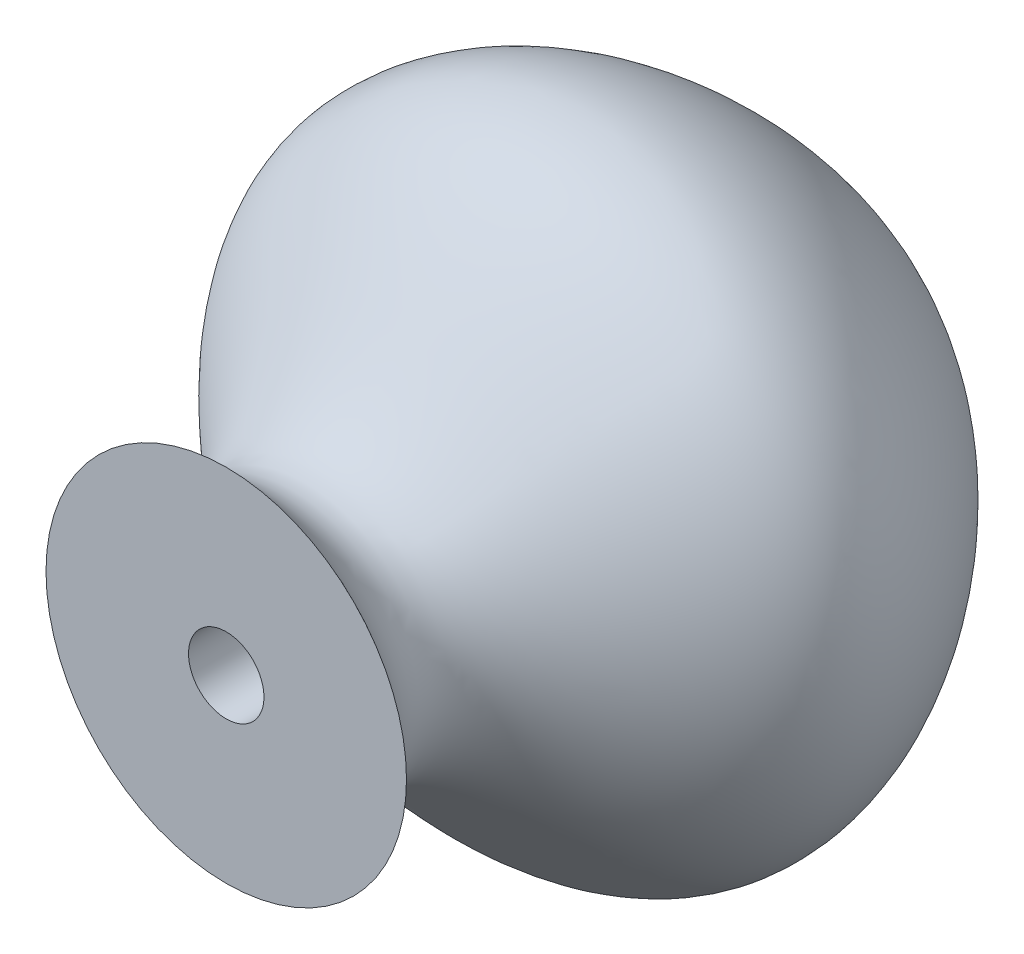
ISO-10303-21;
HEADER;
FILE_DESCRIPTION(('STEP AP214'),'2;1');
FILE_NAME('part.step','',(''),(''),'','','');
FILE_SCHEMA(('AUTOMOTIVE_DESIGN { 1 0 10303 214 1 1 1 1 }'));
ENDSEC;
DATA;
#1=APPLICATION_CONTEXT('core data for automotive mechanical design processes');
#2=APPLICATION_PROTOCOL_DEFINITION('international standard','automotive_design',2000,#1);
#3=PRODUCT_CONTEXT('',#1,'mechanical');
#4=PRODUCT('Part','Part','',(#3));
#5=PRODUCT_RELATED_PRODUCT_CATEGORY('part','',(#4));
#6=PRODUCT_DEFINITION_FORMATION('','',#4);
#7=PRODUCT_DEFINITION_CONTEXT('part definition',#1,'design');
#8=PRODUCT_DEFINITION('design','',#6,#7);
#9=PRODUCT_DEFINITION_SHAPE('','',#8);
#10=(LENGTH_UNIT() NAMED_UNIT(*) SI_UNIT(.MILLI.,.METRE.));
#11=(NAMED_UNIT(*) PLANE_ANGLE_UNIT() SI_UNIT($,.RADIAN.));
#12=(NAMED_UNIT(*) SI_UNIT($,.STERADIAN.) SOLID_ANGLE_UNIT());
#13=UNCERTAINTY_MEASURE_WITH_UNIT(LENGTH_MEASURE(1.E-05),#10,'distance_accuracy_value','');
#14=(GEOMETRIC_REPRESENTATION_CONTEXT(3) GLOBAL_UNCERTAINTY_ASSIGNED_CONTEXT((#13)) GLOBAL_UNIT_ASSIGNED_CONTEXT((#10,
#11,#12)) REPRESENTATION_CONTEXT('',''));
#15=CARTESIAN_POINT('',(0.,0.,0.));
#16=DIRECTION('',(0.,0.,1.));
#17=DIRECTION('',(1.,0.,0.));
#18=AXIS2_PLACEMENT_3D('',#15,#16,#17);
#19=CARTESIAN_POINT('',(0.,0.,-16.5));
#20=CARTESIAN_POINT('',(7.15870426578362,0.,-18.1463565664161));
#21=CARTESIAN_POINT('',(22.205045428789,0.,-3.94968204076572));
#22=CARTESIAN_POINT('',(10.6151053512965,0.,7.39001942471827));
#23=CARTESIAN_POINT('',(3.86672495528104,0.,12.6641340510165));
#24=CARTESIAN_POINT('',(9.55425872527705,0.,16.5));
#25=B_SPLINE_CURVE_WITH_KNOTS('',3,(#19,#20,#21,#22,#23,#24),.UNSPECIFIED.,.F.,.F.,(4,1,1,4),
(0.,0.5495189385593,0.720750841557417,1.),.UNSPECIFIED.);
#26=CARTESIAN_POINT('',(0.,0.,-16.5));
#27=DIRECTION('',(0.,0.,-1.));
#28=AXIS1_PLACEMENT('',#26,#27);
#29=SURFACE_OF_REVOLUTION('',#25,#28);
#30=CARTESIAN_POINT('',(0.,0.,16.5));
#31=DIRECTION('',(0.,0.,-1.));
#32=DIRECTION('',(-1.,0.,0.));
#33=AXIS2_PLACEMENT_3D('',#30,#31,#32);
#34=CIRCLE('',#33,9.55425872527705);
#35=CARTESIAN_POINT('',(-9.55425872527705,0.,16.5));
#36=VERTEX_POINT('',#35);
#37=EDGE_CURVE('E11',#36,#36,#34,.T.);
#38=ORIENTED_EDGE('',*,*,#37,.T.);
#39=EDGE_LOOP('',(#38));
#40=FACE_BOUND('',#39,.T.);
#41=CARTESIAN_POINT('',(0.,0.,-16.5));
#42=VERTEX_POINT('',#41);
#43=VERTEX_LOOP('',#42);
#44=FACE_BOUND('',#43,.T.);
#45=ADVANCED_FACE('F35',(#40,#44),#29,.F.);
#46=CARTESIAN_POINT('',(0.,0.,16.5));
#47=DIRECTION('',(0.,0.,-1.));
#48=DIRECTION('',(-1.,0.,0.));
#49=AXIS2_PLACEMENT_3D('',#46,#47,#48);
#50=PLANE('',#49);
#51=CARTESIAN_POINT('',(0.,0.,16.5));
#52=DIRECTION('',(0.,0.,1.));
#53=DIRECTION('',(1.,0.,0.));
#54=AXIS2_PLACEMENT_3D('',#51,#52,#53);
#55=CIRCLE('',#54,2.);
#56=CARTESIAN_POINT('',(2.,0.,16.5));
#57=VERTEX_POINT('',#56);
#58=EDGE_CURVE('E68',#57,#57,#55,.T.);
#59=ORIENTED_EDGE('',*,*,#58,.F.);
#60=EDGE_LOOP('',(#59));
#61=FACE_BOUND('',#60,.T.);
#62=ORIENTED_EDGE('',*,*,#37,.F.);
#63=EDGE_LOOP('',(#62));
#64=FACE_BOUND('',#63,.T.);
#65=ADVANCED_FACE('F45',(#61,#64),#50,.F.);
#66=CARTESIAN_POINT('',(0.,0.,11.5));
#67=DIRECTION('',(0.,0.,1.));
#68=DIRECTION('',(1.,0.,0.));
#69=AXIS2_PLACEMENT_3D('',#66,#67,#68);
#70=CYLINDRICAL_SURFACE('',#69,2.);
#71=CARTESIAN_POINT('',(0.,0.,11.5));
#72=DIRECTION('',(0.,0.,1.));
#73=DIRECTION('',(1.,0.,0.));
#74=AXIS2_PLACEMENT_3D('',#71,#72,#73);
#75=CIRCLE('',#74,2.);
#76=CARTESIAN_POINT('',(2.,0.,11.5));
#77=VERTEX_POINT('',#76);
#78=EDGE_CURVE('E41',#77,#77,#75,.T.);
#79=ORIENTED_EDGE('',*,*,#78,.F.);
#80=EDGE_LOOP('',(#79));
#81=FACE_BOUND('',#80,.T.);
#82=ORIENTED_EDGE('',*,*,#58,.T.);
#83=EDGE_LOOP('',(#82));
#84=FACE_BOUND('',#83,.T.);
#85=ADVANCED_FACE('F50',(#81,#84),#70,.F.);
#86=CARTESIAN_POINT('',(0.,0.,11.5));
#87=DIRECTION('',(0.,0.,1.));
#88=DIRECTION('',(1.,0.,0.));
#89=AXIS2_PLACEMENT_3D('',#86,#87,#88);
#90=PLANE('',#89);
#91=ORIENTED_EDGE('',*,*,#78,.T.);
#92=EDGE_LOOP('',(#91));
#93=FACE_BOUND('',#92,.T.);
#94=ADVANCED_FACE('F57',(#93),#90,.T.);
#95=CLOSED_SHELL('',(#45,#65,#85,#94));
#96=MANIFOLD_SOLID_BREP('B2',#95);
#97=ADVANCED_BREP_SHAPE_REPRESENTATION('',(#18,#96),#14);
#98=SHAPE_DEFINITION_REPRESENTATION(#9,#97);
ENDSEC;
END-ISO-10303-21;
